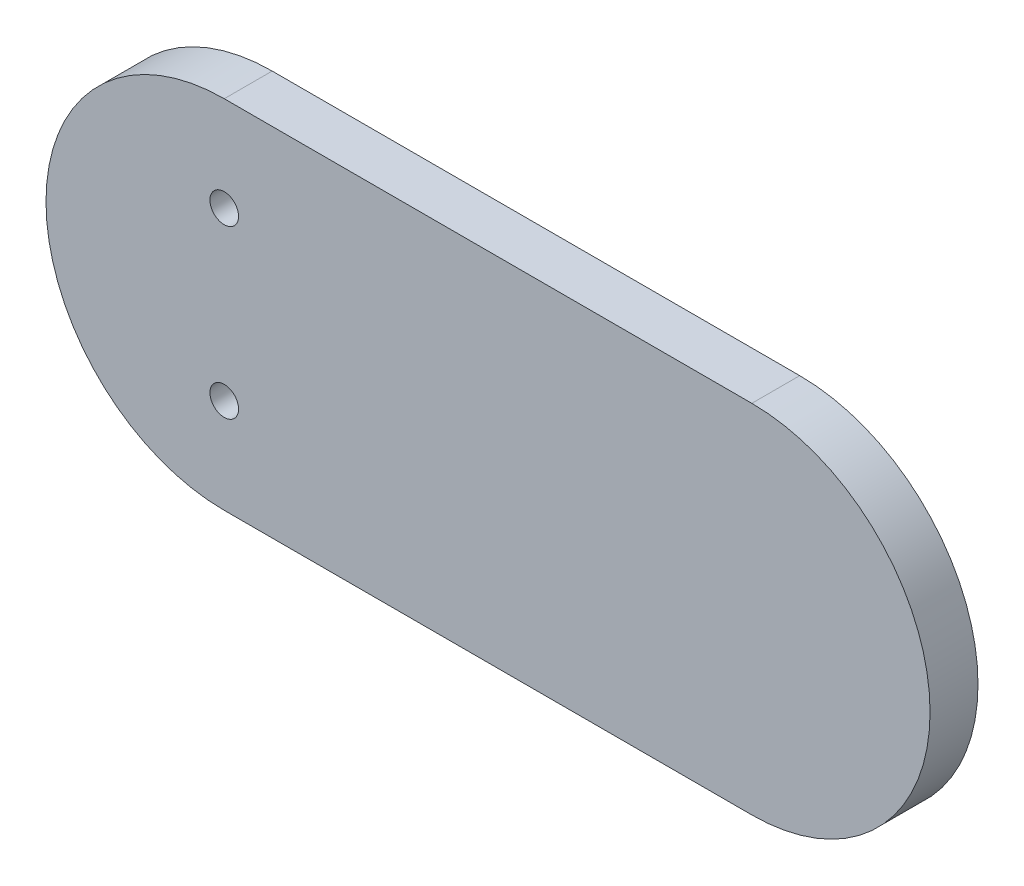
ISO-10303-21;
HEADER;
FILE_DESCRIPTION(('STEP AP214'),'2;1');
FILE_NAME('part.step','',(''),(''),'','','');
FILE_SCHEMA(('AUTOMOTIVE_DESIGN { 1 0 10303 214 1 1 1 1 }'));
ENDSEC;
DATA;
#1=APPLICATION_CONTEXT('core data for automotive mechanical design processes');
#2=APPLICATION_PROTOCOL_DEFINITION('international standard','automotive_design',2000,#1);
#3=PRODUCT_CONTEXT('',#1,'mechanical');
#4=PRODUCT('Part','Part','',(#3));
#5=PRODUCT_RELATED_PRODUCT_CATEGORY('part','',(#4));
#6=PRODUCT_DEFINITION_FORMATION('','',#4);
#7=PRODUCT_DEFINITION_CONTEXT('part definition',#1,'design');
#8=PRODUCT_DEFINITION('design','',#6,#7);
#9=PRODUCT_DEFINITION_SHAPE('','',#8);
#10=(LENGTH_UNIT() NAMED_UNIT(*) SI_UNIT(.MILLI.,.METRE.));
#11=(NAMED_UNIT(*) PLANE_ANGLE_UNIT() SI_UNIT($,.RADIAN.));
#12=(NAMED_UNIT(*) SI_UNIT($,.STERADIAN.) SOLID_ANGLE_UNIT());
#13=UNCERTAINTY_MEASURE_WITH_UNIT(LENGTH_MEASURE(1.E-05),#10,'distance_accuracy_value','');
#14=(GEOMETRIC_REPRESENTATION_CONTEXT(3) GLOBAL_UNCERTAINTY_ASSIGNED_CONTEXT((#13)) GLOBAL_UNIT_ASSIGNED_CONTEXT((#10,
#11,#12)) REPRESENTATION_CONTEXT('',''));
#15=CARTESIAN_POINT('',(0.,0.,0.));
#16=DIRECTION('',(0.,0.,1.));
#17=DIRECTION('',(1.,0.,0.));
#18=AXIS2_PLACEMENT_3D('',#15,#16,#17);
#19=CARTESIAN_POINT('',(-17.5,0.,1.59));
#20=DIRECTION('',(0.,0.,-1.));
#21=DIRECTION('',(-1.,0.,0.));
#22=AXIS2_PLACEMENT_3D('',#19,#20,#21);
#23=CYLINDRICAL_SURFACE('',#22,11.825);
#24=CARTESIAN_POINT('',(-17.5,0.,-1.59));
#25=DIRECTION('',(0.,0.,1.));
#26=DIRECTION('',(1.,0.,0.));
#27=AXIS2_PLACEMENT_3D('',#24,#25,#26);
#28=CIRCLE('',#27,11.825);
#29=CARTESIAN_POINT('',(-17.5,11.825,-1.59));
#30=VERTEX_POINT('',#29);
#31=CARTESIAN_POINT('',(-17.5,-11.825,-1.59));
#32=VERTEX_POINT('',#31);
#33=EDGE_CURVE('E103',#30,#32,#28,.T.);
#34=ORIENTED_EDGE('',*,*,#33,.T.);
#35=DIRECTION('',(0.,0.,-1.));
#36=VECTOR('',#35,1.);
#37=CARTESIAN_POINT('',(-17.5,-11.825,1.59));
#38=LINE('',#37,#36);
#39=CARTESIAN_POINT('',(-17.5,-11.825,1.59));
#40=VERTEX_POINT('',#39);
#41=EDGE_CURVE('E11',#40,#32,#38,.T.);
#42=ORIENTED_EDGE('',*,*,#41,.F.);
#43=CARTESIAN_POINT('',(-17.5,0.,1.59));
#44=DIRECTION('',(0.,0.,1.));
#45=DIRECTION('',(1.,0.,0.));
#46=AXIS2_PLACEMENT_3D('',#43,#44,#45);
#47=CIRCLE('',#46,11.825);
#48=CARTESIAN_POINT('',(-17.5,11.825,1.59));
#49=VERTEX_POINT('',#48);
#50=EDGE_CURVE('E90',#49,#40,#47,.T.);
#51=ORIENTED_EDGE('',*,*,#50,.F.);
#52=DIRECTION('',(0.,0.,-1.));
#53=VECTOR('',#52,1.);
#54=CARTESIAN_POINT('',(-17.5,11.825,1.59));
#55=LINE('',#54,#53);
#56=EDGE_CURVE('E99',#49,#30,#55,.T.);
#57=ORIENTED_EDGE('',*,*,#56,.T.);
#58=EDGE_LOOP('',(#34,#42,#51,#57));
#59=FACE_BOUND('',#58,.T.);
#60=ADVANCED_FACE('F37',(#59),#23,.T.);
#61=CARTESIAN_POINT('',(-17.5,-11.825,1.59));
#62=DIRECTION('',(0.,1.,0.));
#63=DIRECTION('',(0.,0.,1.));
#64=AXIS2_PLACEMENT_3D('',#61,#62,#63);
#65=PLANE('',#64);
#66=DIRECTION('',(1.,0.,0.));
#67=VECTOR('',#66,1.);
#68=CARTESIAN_POINT('',(-17.5,-11.825,-1.59));
#69=LINE('',#68,#67);
#70=CARTESIAN_POINT('',(17.5,-11.825,-1.59));
#71=VERTEX_POINT('',#70);
#72=EDGE_CURVE('E94',#32,#71,#69,.T.);
#73=ORIENTED_EDGE('',*,*,#72,.T.);
#74=DIRECTION('',(0.,0.,-1.));
#75=VECTOR('',#74,1.);
#76=CARTESIAN_POINT('',(17.5,-11.825,1.59));
#77=LINE('',#76,#75);
#78=CARTESIAN_POINT('',(17.5,-11.825,1.59));
#79=VERTEX_POINT('',#78);
#80=EDGE_CURVE('E46',#79,#71,#77,.T.);
#81=ORIENTED_EDGE('',*,*,#80,.F.);
#82=DIRECTION('',(1.,0.,0.));
#83=VECTOR('',#82,1.);
#84=CARTESIAN_POINT('',(-17.5,-11.825,1.59));
#85=LINE('',#84,#83);
#86=EDGE_CURVE('E85',#40,#79,#85,.T.);
#87=ORIENTED_EDGE('',*,*,#86,.F.);
#88=ORIENTED_EDGE('',*,*,#41,.T.);
#89=EDGE_LOOP('',(#73,#81,#87,#88));
#90=FACE_BOUND('',#89,.T.);
#91=ADVANCED_FACE('F93',(#90),#65,.F.);
#92=CARTESIAN_POINT('',(17.5,0.,1.59));
#93=DIRECTION('',(0.,0.,-1.));
#94=DIRECTION('',(-1.,0.,0.));
#95=AXIS2_PLACEMENT_3D('',#92,#93,#94);
#96=CYLINDRICAL_SURFACE('',#95,11.825);
#97=CARTESIAN_POINT('',(17.5,0.,-1.59));
#98=DIRECTION('',(0.,0.,1.));
#99=DIRECTION('',(1.,0.,0.));
#100=AXIS2_PLACEMENT_3D('',#97,#98,#99);
#101=CIRCLE('',#100,11.825);
#102=CARTESIAN_POINT('',(17.5,11.825,-1.59));
#103=VERTEX_POINT('',#102);
#104=EDGE_CURVE('E72',#71,#103,#101,.T.);
#105=ORIENTED_EDGE('',*,*,#104,.T.);
#106=DIRECTION('',(0.,0.,-1.));
#107=VECTOR('',#106,1.);
#108=CARTESIAN_POINT('',(17.5,11.825,1.59));
#109=LINE('',#108,#107);
#110=CARTESIAN_POINT('',(17.5,11.825,1.59));
#111=VERTEX_POINT('',#110);
#112=EDGE_CURVE('E95',#111,#103,#109,.T.);
#113=ORIENTED_EDGE('',*,*,#112,.F.);
#114=CARTESIAN_POINT('',(17.5,0.,1.59));
#115=DIRECTION('',(0.,0.,1.));
#116=DIRECTION('',(1.,0.,0.));
#117=AXIS2_PLACEMENT_3D('',#114,#115,#116);
#118=CIRCLE('',#117,11.825);
#119=EDGE_CURVE('E88',#79,#111,#118,.T.);
#120=ORIENTED_EDGE('',*,*,#119,.F.);
#121=ORIENTED_EDGE('',*,*,#80,.T.);
#122=EDGE_LOOP('',(#105,#113,#120,#121));
#123=FACE_BOUND('',#122,.T.);
#124=ADVANCED_FACE('F97',(#123),#96,.T.);
#125=CARTESIAN_POINT('',(-17.5,11.825,1.59));
#126=DIRECTION('',(0.,-1.,0.));
#127=DIRECTION('',(0.,0.,-1.));
#128=AXIS2_PLACEMENT_3D('',#125,#126,#127);
#129=PLANE('',#128);
#130=DIRECTION('',(-1.,0.,0.));
#131=VECTOR('',#130,1.);
#132=CARTESIAN_POINT('',(-17.5,11.825,-1.59));
#133=LINE('',#132,#131);
#134=EDGE_CURVE('E78',#103,#30,#133,.T.);
#135=ORIENTED_EDGE('',*,*,#134,.T.);
#136=ORIENTED_EDGE('',*,*,#56,.F.);
#137=DIRECTION('',(-1.,0.,0.));
#138=VECTOR('',#137,1.);
#139=CARTESIAN_POINT('',(-17.5,11.825,1.59));
#140=LINE('',#139,#138);
#141=EDGE_CURVE('E55',#111,#49,#140,.T.);
#142=ORIENTED_EDGE('',*,*,#141,.F.);
#143=ORIENTED_EDGE('',*,*,#112,.T.);
#144=EDGE_LOOP('',(#135,#136,#142,#143));
#145=FACE_BOUND('',#144,.T.);
#146=ADVANCED_FACE('F130',(#145),#129,.F.);
#147=CARTESIAN_POINT('',(-17.5,0.,1.59));
#148=DIRECTION('',(0.,0.,1.));
#149=DIRECTION('',(1.,0.,0.));
#150=AXIS2_PLACEMENT_3D('',#147,#148,#149);
#151=PLANE('',#150);
#152=CARTESIAN_POINT('',(-17.5,5.535,1.59));
#153=DIRECTION('',(0.,0.,1.));
#154=DIRECTION('',(1.,0.,0.));
#155=AXIS2_PLACEMENT_3D('',#152,#153,#154);
#156=CIRCLE('',#155,0.950000000000001);
#157=CARTESIAN_POINT('',(-16.55,5.535,1.59));
#158=VERTEX_POINT('',#157);
#159=EDGE_CURVE('E112',#158,#158,#156,.T.);
#160=ORIENTED_EDGE('',*,*,#159,.F.);
#161=EDGE_LOOP('',(#160));
#162=FACE_BOUND('',#161,.T.);
#163=CARTESIAN_POINT('',(-17.5,-5.535,1.59));
#164=DIRECTION('',(0.,0.,1.));
#165=DIRECTION('',(1.,0.,0.));
#166=AXIS2_PLACEMENT_3D('',#163,#164,#165);
#167=CIRCLE('',#166,0.950000000000001);
#168=CARTESIAN_POINT('',(-16.55,-5.535,1.59));
#169=VERTEX_POINT('',#168);
#170=EDGE_CURVE('E117',#169,#169,#167,.T.);
#171=ORIENTED_EDGE('',*,*,#170,.F.);
#172=EDGE_LOOP('',(#171));
#173=FACE_BOUND('',#172,.T.);
#174=ORIENTED_EDGE('',*,*,#50,.T.);
#175=ORIENTED_EDGE('',*,*,#86,.T.);
#176=ORIENTED_EDGE('',*,*,#119,.T.);
#177=ORIENTED_EDGE('',*,*,#141,.T.);
#178=EDGE_LOOP('',(#174,#175,#176,#177));
#179=FACE_BOUND('',#178,.T.);
#180=ADVANCED_FACE('F86',(#162,#173,#179),#151,.T.);
#181=CARTESIAN_POINT('',(-17.5,0.,-1.59));
#182=DIRECTION('',(0.,0.,1.));
#183=DIRECTION('',(1.,0.,0.));
#184=AXIS2_PLACEMENT_3D('',#181,#182,#183);
#185=PLANE('',#184);
#186=CARTESIAN_POINT('',(-17.5,5.535,-1.59));
#187=DIRECTION('',(0.,0.,1.));
#188=DIRECTION('',(1.,0.,0.));
#189=AXIS2_PLACEMENT_3D('',#186,#187,#188);
#190=CIRCLE('',#189,0.950000000000001);
#191=CARTESIAN_POINT('',(-16.55,5.535,-1.59));
#192=VERTEX_POINT('',#191);
#193=EDGE_CURVE('E40',#192,#192,#190,.T.);
#194=ORIENTED_EDGE('',*,*,#193,.T.);
#195=EDGE_LOOP('',(#194));
#196=FACE_BOUND('',#195,.T.);
#197=CARTESIAN_POINT('',(-17.5,-5.535,-1.59));
#198=DIRECTION('',(0.,0.,1.));
#199=DIRECTION('',(1.,0.,0.));
#200=AXIS2_PLACEMENT_3D('',#197,#198,#199);
#201=CIRCLE('',#200,0.950000000000001);
#202=CARTESIAN_POINT('',(-16.55,-5.535,-1.59));
#203=VERTEX_POINT('',#202);
#204=EDGE_CURVE('E110',#203,#203,#201,.T.);
#205=ORIENTED_EDGE('',*,*,#204,.T.);
#206=EDGE_LOOP('',(#205));
#207=FACE_BOUND('',#206,.T.);
#208=ORIENTED_EDGE('',*,*,#33,.F.);
#209=ORIENTED_EDGE('',*,*,#134,.F.);
#210=ORIENTED_EDGE('',*,*,#104,.F.);
#211=ORIENTED_EDGE('',*,*,#72,.F.);
#212=EDGE_LOOP('',(#208,#209,#210,#211));
#213=FACE_BOUND('',#212,.T.);
#214=ADVANCED_FACE('F129',(#196,#207,#213),#185,.F.);
#215=CARTESIAN_POINT('',(-17.5,-5.535,-8.41));
#216=DIRECTION('',(0.,0.,1.));
#217=DIRECTION('',(1.,0.,0.));
#218=AXIS2_PLACEMENT_3D('',#215,#216,#217);
#219=CYLINDRICAL_SURFACE('',#218,0.950000000000001);
#220=ORIENTED_EDGE('',*,*,#170,.T.);
#221=EDGE_LOOP('',(#220));
#222=FACE_BOUND('',#221,.T.);
#223=ORIENTED_EDGE('',*,*,#204,.F.);
#224=EDGE_LOOP('',(#223));
#225=FACE_BOUND('',#224,.T.);
#226=ADVANCED_FACE('F125',(#222,#225),#219,.F.);
#227=CARTESIAN_POINT('',(-17.5,5.535,-8.41));
#228=DIRECTION('',(0.,0.,1.));
#229=DIRECTION('',(1.,0.,0.));
#230=AXIS2_PLACEMENT_3D('',#227,#228,#229);
#231=CYLINDRICAL_SURFACE('',#230,0.950000000000001);
#232=ORIENTED_EDGE('',*,*,#159,.T.);
#233=EDGE_LOOP('',(#232));
#234=FACE_BOUND('',#233,.T.);
#235=ORIENTED_EDGE('',*,*,#193,.F.);
#236=EDGE_LOOP('',(#235));
#237=FACE_BOUND('',#236,.T.);
#238=ADVANCED_FACE('F177',(#234,#237),#231,.F.);
#239=CLOSED_SHELL('',(#60,#91,#124,#146,#180,#214,#226,#238));
#240=MANIFOLD_SOLID_BREP('B2',#239);
#241=ADVANCED_BREP_SHAPE_REPRESENTATION('',(#18,#240),#14);
#242=SHAPE_DEFINITION_REPRESENTATION(#9,#241);
ENDSEC;
END-ISO-10303-21;
